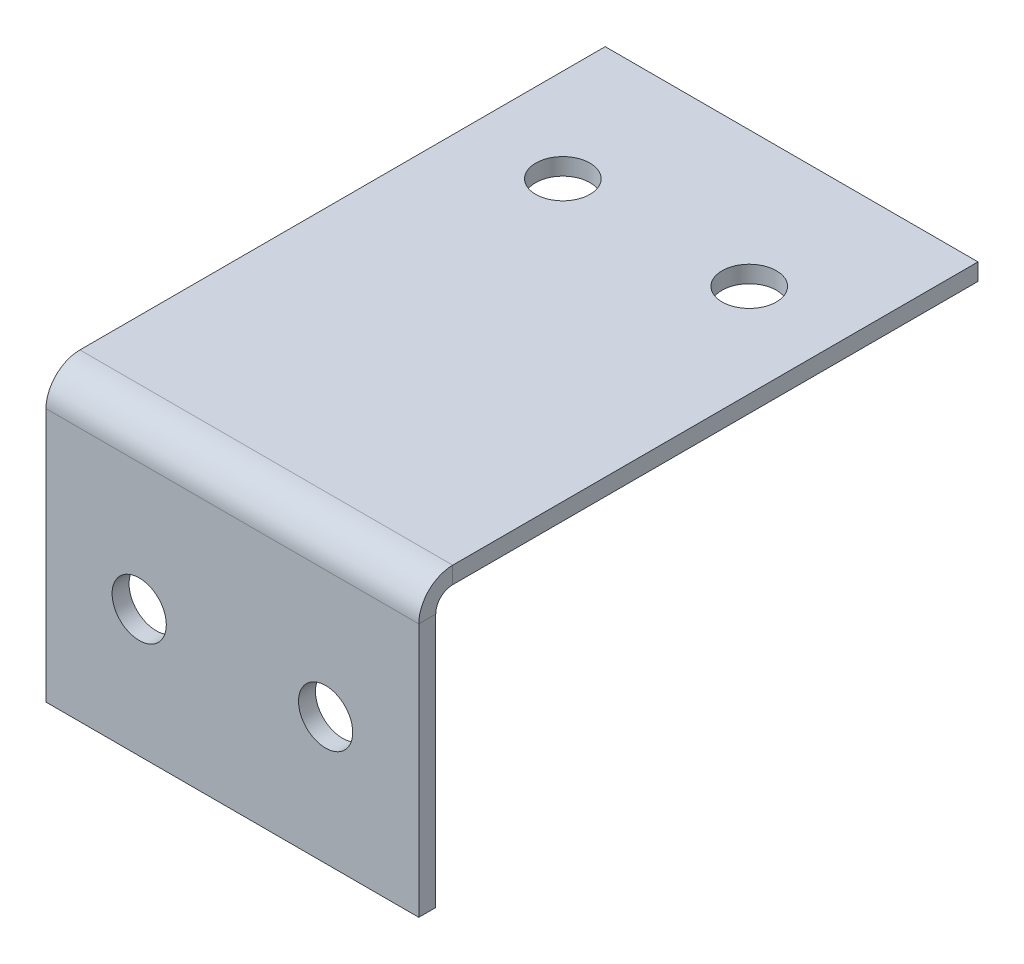
ISO-10303-21;
HEADER;
FILE_DESCRIPTION(('STEP AP214'),'2;1');
FILE_NAME('part.step','',(''),(''),'','','');
FILE_SCHEMA(('AUTOMOTIVE_DESIGN { 1 0 10303 214 1 1 1 1 }'));
ENDSEC;
DATA;
#1=APPLICATION_CONTEXT('core data for automotive mechanical design processes');
#2=APPLICATION_PROTOCOL_DEFINITION('international standard','automotive_design',2000,#1);
#3=PRODUCT_CONTEXT('',#1,'mechanical');
#4=PRODUCT('Part','Part','',(#3));
#5=PRODUCT_RELATED_PRODUCT_CATEGORY('part','',(#4));
#6=PRODUCT_DEFINITION_FORMATION('','',#4);
#7=PRODUCT_DEFINITION_CONTEXT('part definition',#1,'design');
#8=PRODUCT_DEFINITION('design','',#6,#7);
#9=PRODUCT_DEFINITION_SHAPE('','',#8);
#10=(LENGTH_UNIT() NAMED_UNIT(*) SI_UNIT(.MILLI.,.METRE.));
#11=(NAMED_UNIT(*) PLANE_ANGLE_UNIT() SI_UNIT($,.RADIAN.));
#12=(NAMED_UNIT(*) SI_UNIT($,.STERADIAN.) SOLID_ANGLE_UNIT());
#13=UNCERTAINTY_MEASURE_WITH_UNIT(LENGTH_MEASURE(1.E-05),#10,'distance_accuracy_value','');
#14=(GEOMETRIC_REPRESENTATION_CONTEXT(3) GLOBAL_UNCERTAINTY_ASSIGNED_CONTEXT((#13)) GLOBAL_UNIT_ASSIGNED_CONTEXT((#10,
#11,#12)) REPRESENTATION_CONTEXT('',''));
#15=CARTESIAN_POINT('',(0.,0.,0.));
#16=DIRECTION('',(0.,0.,1.));
#17=DIRECTION('',(1.,0.,0.));
#18=AXIS2_PLACEMENT_3D('',#15,#16,#17);
#19=CARTESIAN_POINT('',(-17.4625,25.4,-1.5875));
#20=DIRECTION('',(-1.,0.,0.));
#21=DIRECTION('',(0.,0.,1.));
#22=AXIS2_PLACEMENT_3D('',#19,#20,#21);
#23=PLANE('',#22);
#24=DIRECTION('',(0.,1.,0.));
#25=VECTOR('',#24,1.);
#26=CARTESIAN_POINT('',(-17.4625,25.4,-1.5875));
#27=LINE('',#26,#25);
#28=CARTESIAN_POINT('',(-17.4625,25.4,-1.5875));
#29=VERTEX_POINT('',#28);
#30=CARTESIAN_POINT('',(-17.4625,26.9875,-1.5875));
#31=VERTEX_POINT('',#30);
#32=EDGE_CURVE('E11',#29,#31,#27,.T.);
#33=ORIENTED_EDGE('',*,*,#32,.F.);
#34=CARTESIAN_POINT('',(-17.4625,23.8125,-1.5875));
#35=DIRECTION('',(1.,0.,0.));
#36=DIRECTION('',(0.,0.,-1.));
#37=AXIS2_PLACEMENT_3D('',#34,#35,#36);
#38=CIRCLE('',#37,1.5875);
#39=CARTESIAN_POINT('',(-17.4625,23.8125,0.));
#40=VERTEX_POINT('',#39);
#41=EDGE_CURVE('E135',#40,#29,#38,.F.);
#42=ORIENTED_EDGE('',*,*,#41,.F.);
#43=DIRECTION('',(0.,0.,-1.));
#44=VECTOR('',#43,1.);
#45=CARTESIAN_POINT('',(-17.4625,23.8125,1.5875));
#46=LINE('',#45,#44);
#47=CARTESIAN_POINT('',(-17.4625,23.8125,1.5875));
#48=VERTEX_POINT('',#47);
#49=EDGE_CURVE('E46',#48,#40,#46,.T.);
#50=ORIENTED_EDGE('',*,*,#49,.F.);
#51=CARTESIAN_POINT('',(-17.4625,23.8125,-1.5875));
#52=DIRECTION('',(1.,0.,0.));
#53=DIRECTION('',(0.,0.,-1.));
#54=AXIS2_PLACEMENT_3D('',#51,#52,#53);
#55=CIRCLE('',#54,3.175);
#56=EDGE_CURVE('E188',#48,#31,#55,.F.);
#57=ORIENTED_EDGE('',*,*,#56,.T.);
#58=EDGE_LOOP('',(#33,#42,#50,#57));
#59=FACE_BOUND('',#58,.T.);
#60=ADVANCED_FACE('F38',(#59),#23,.T.);
#61=CARTESIAN_POINT('',(-17.4625,23.8125,1.5875));
#62=DIRECTION('',(-1.,0.,0.));
#63=DIRECTION('',(0.,0.,1.));
#64=AXIS2_PLACEMENT_3D('',#61,#62,#63);
#65=PLANE('',#64);
#66=DIRECTION('',(0.,0.,-1.));
#67=VECTOR('',#66,1.);
#68=CARTESIAN_POINT('',(-17.4625,25.4,0.));
#69=LINE('',#68,#67);
#70=CARTESIAN_POINT('',(-17.4625,25.4,-50.8));
#71=VERTEX_POINT('',#70);
#72=EDGE_CURVE('E161',#29,#71,#69,.T.);
#73=ORIENTED_EDGE('',*,*,#72,.F.);
#74=ORIENTED_EDGE('',*,*,#32,.T.);
#75=DIRECTION('',(0.,0.,-1.));
#76=VECTOR('',#75,1.);
#77=CARTESIAN_POINT('',(-17.4625,26.9875,0.));
#78=LINE('',#77,#76);
#79=CARTESIAN_POINT('',(-17.4625,26.9875,-50.8));
#80=VERTEX_POINT('',#79);
#81=EDGE_CURVE('E204',#31,#80,#78,.T.);
#82=ORIENTED_EDGE('',*,*,#81,.T.);
#83=DIRECTION('',(0.,-1.,0.));
#84=VECTOR('',#83,1.);
#85=CARTESIAN_POINT('',(-17.4625,26.9875,-50.8));
#86=LINE('',#85,#84);
#87=EDGE_CURVE('E97',#80,#71,#86,.T.);
#88=ORIENTED_EDGE('',*,*,#87,.T.);
#89=EDGE_LOOP('',(#73,#74,#82,#88));
#90=FACE_BOUND('',#89,.T.);
#91=ADVANCED_FACE('F260',(#90),#65,.T.);
#92=CARTESIAN_POINT('',(17.4625,23.8125,0.));
#93=DIRECTION('',(1.,0.,0.));
#94=DIRECTION('',(0.,0.,-1.));
#95=AXIS2_PLACEMENT_3D('',#92,#93,#94);
#96=PLANE('',#95);
#97=DIRECTION('',(0.,0.,1.));
#98=VECTOR('',#97,1.);
#99=CARTESIAN_POINT('',(17.4625,23.8125,0.));
#100=LINE('',#99,#98);
#101=CARTESIAN_POINT('',(17.4625,23.8125,0.));
#102=VERTEX_POINT('',#101);
#103=CARTESIAN_POINT('',(17.4625,23.8125,1.5875));
#104=VERTEX_POINT('',#103);
#105=EDGE_CURVE('E81',#102,#104,#100,.T.);
#106=ORIENTED_EDGE('',*,*,#105,.F.);
#107=CARTESIAN_POINT('',(17.4625,23.8125,-1.5875));
#108=DIRECTION('',(1.,0.,0.));
#109=DIRECTION('',(0.,0.,-1.));
#110=AXIS2_PLACEMENT_3D('',#107,#108,#109);
#111=CIRCLE('',#110,1.5875);
#112=CARTESIAN_POINT('',(17.4625,25.4,-1.5875));
#113=VERTEX_POINT('',#112);
#114=EDGE_CURVE('E159',#102,#113,#111,.F.);
#115=ORIENTED_EDGE('',*,*,#114,.T.);
#116=DIRECTION('',(0.,-1.,0.));
#117=VECTOR('',#116,1.);
#118=CARTESIAN_POINT('',(17.4625,26.9875,-1.5875));
#119=LINE('',#118,#117);
#120=CARTESIAN_POINT('',(17.4625,26.9875,-1.5875));
#121=VERTEX_POINT('',#120);
#122=EDGE_CURVE('E88',#121,#113,#119,.T.);
#123=ORIENTED_EDGE('',*,*,#122,.F.);
#124=CARTESIAN_POINT('',(17.4625,23.8125,-1.5875));
#125=DIRECTION('',(1.,0.,0.));
#126=DIRECTION('',(0.,0.,-1.));
#127=AXIS2_PLACEMENT_3D('',#124,#125,#126);
#128=CIRCLE('',#127,3.175);
#129=EDGE_CURVE('E150',#104,#121,#128,.F.);
#130=ORIENTED_EDGE('',*,*,#129,.F.);
#131=EDGE_LOOP('',(#106,#115,#123,#130));
#132=FACE_BOUND('',#131,.T.);
#133=ADVANCED_FACE('F189',(#132),#96,.T.);
#134=CARTESIAN_POINT('',(17.4625,26.9875,-1.5875));
#135=DIRECTION('',(1.,0.,0.));
#136=DIRECTION('',(0.,0.,-1.));
#137=AXIS2_PLACEMENT_3D('',#134,#135,#136);
#138=PLANE('',#137);
#139=DIRECTION('',(0.,1.,0.));
#140=VECTOR('',#139,1.);
#141=CARTESIAN_POINT('',(17.4625,0.,0.));
#142=LINE('',#141,#140);
#143=CARTESIAN_POINT('',(17.4625,0.,0.));
#144=VERTEX_POINT('',#143);
#145=EDGE_CURVE('E118',#144,#102,#142,.T.);
#146=ORIENTED_EDGE('',*,*,#145,.T.);
#147=ORIENTED_EDGE('',*,*,#105,.T.);
#148=DIRECTION('',(0.,1.,0.));
#149=VECTOR('',#148,1.);
#150=CARTESIAN_POINT('',(17.4625,0.,1.5875));
#151=LINE('',#150,#149);
#152=CARTESIAN_POINT('',(17.4625,0.,1.5875));
#153=VERTEX_POINT('',#152);
#154=EDGE_CURVE('E153',#153,#104,#151,.T.);
#155=ORIENTED_EDGE('',*,*,#154,.F.);
#156=DIRECTION('',(0.,0.,1.));
#157=VECTOR('',#156,1.);
#158=CARTESIAN_POINT('',(17.4625,0.,0.));
#159=LINE('',#158,#157);
#160=EDGE_CURVE('E156',#144,#153,#159,.T.);
#161=ORIENTED_EDGE('',*,*,#160,.F.);
#162=EDGE_LOOP('',(#146,#147,#155,#161));
#163=FACE_BOUND('',#162,.T.);
#164=ADVANCED_FACE('F179',(#163),#138,.T.);
#165=CARTESIAN_POINT('',(-17.4625,25.4,0.));
#166=DIRECTION('',(0.,-1.,0.));
#167=DIRECTION('',(0.,0.,-1.));
#168=AXIS2_PLACEMENT_3D('',#165,#166,#167);
#169=PLANE('',#168);
#170=CARTESIAN_POINT('',(8.73125,25.4,-38.1));
#171=DIRECTION('',(0.,1.,0.));
#172=DIRECTION('',(0.,0.,1.));
#173=AXIS2_PLACEMENT_3D('',#170,#171,#172);
#174=CIRCLE('',#173,2.54);
#175=CARTESIAN_POINT('',(8.73125,25.4,-35.56));
#176=VERTEX_POINT('',#175);
#177=EDGE_CURVE('E225',#176,#176,#174,.T.);
#178=ORIENTED_EDGE('',*,*,#177,.T.);
#179=EDGE_LOOP('',(#178));
#180=FACE_BOUND('',#179,.T.);
#181=CARTESIAN_POINT('',(-8.73125,25.4,-38.1));
#182=DIRECTION('',(0.,1.,0.));
#183=DIRECTION('',(0.,0.,1.));
#184=AXIS2_PLACEMENT_3D('',#181,#182,#183);
#185=CIRCLE('',#184,2.54);
#186=CARTESIAN_POINT('',(-8.73125,25.4,-35.56));
#187=VERTEX_POINT('',#186);
#188=EDGE_CURVE('E219',#187,#187,#185,.T.);
#189=ORIENTED_EDGE('',*,*,#188,.T.);
#190=EDGE_LOOP('',(#189));
#191=FACE_BOUND('',#190,.T.);
#192=DIRECTION('',(0.,0.,-1.));
#193=VECTOR('',#192,1.);
#194=CARTESIAN_POINT('',(17.4625,25.4,0.));
#195=LINE('',#194,#193);
#196=CARTESIAN_POINT('',(17.4625,25.4,-50.8));
#197=VERTEX_POINT('',#196);
#198=EDGE_CURVE('E142',#113,#197,#195,.T.);
#199=ORIENTED_EDGE('',*,*,#198,.F.);
#200=DIRECTION('',(1.,0.,0.));
#201=VECTOR('',#200,1.);
#202=CARTESIAN_POINT('',(-17.4625,25.4,-1.5875));
#203=LINE('',#202,#201);
#204=EDGE_CURVE('E162',#29,#113,#203,.T.);
#205=ORIENTED_EDGE('',*,*,#204,.F.);
#206=ORIENTED_EDGE('',*,*,#72,.T.);
#207=DIRECTION('',(1.,0.,0.));
#208=VECTOR('',#207,1.);
#209=CARTESIAN_POINT('',(-17.4625,25.4,-50.8));
#210=LINE('',#209,#208);
#211=EDGE_CURVE('E138',#71,#197,#210,.T.);
#212=ORIENTED_EDGE('',*,*,#211,.T.);
#213=EDGE_LOOP('',(#199,#205,#206,#212));
#214=FACE_BOUND('',#213,.T.);
#215=ADVANCED_FACE('F195',(#180,#191,#214),#169,.T.);
#216=CARTESIAN_POINT('',(-17.4625,23.8125,-1.5875));
#217=DIRECTION('',(1.,0.,0.));
#218=DIRECTION('',(0.,0.,-1.));
#219=AXIS2_PLACEMENT_3D('',#216,#217,#218);
#220=CYLINDRICAL_SURFACE('',#219,1.5875);
#221=ORIENTED_EDGE('',*,*,#114,.F.);
#222=DIRECTION('',(1.,0.,0.));
#223=VECTOR('',#222,1.);
#224=CARTESIAN_POINT('',(-17.4625,23.8125,0.));
#225=LINE('',#224,#223);
#226=EDGE_CURVE('E121',#40,#102,#225,.T.);
#227=ORIENTED_EDGE('',*,*,#226,.F.);
#228=ORIENTED_EDGE('',*,*,#41,.T.);
#229=ORIENTED_EDGE('',*,*,#204,.T.);
#230=EDGE_LOOP('',(#221,#227,#228,#229));
#231=FACE_BOUND('',#230,.T.);
#232=ADVANCED_FACE('F191',(#231),#220,.F.);
#233=CARTESIAN_POINT('',(-17.4625,0.,0.));
#234=DIRECTION('',(0.,0.,-1.));
#235=DIRECTION('',(-1.,0.,0.));
#236=AXIS2_PLACEMENT_3D('',#233,#234,#235);
#237=PLANE('',#236);
#238=CARTESIAN_POINT('',(8.73125,11.90625,0.));
#239=DIRECTION('',(0.,0.,1.));
#240=DIRECTION('',(1.,0.,0.));
#241=AXIS2_PLACEMENT_3D('',#238,#239,#240);
#242=CIRCLE('',#241,2.54);
#243=CARTESIAN_POINT('',(11.27125,11.90625,0.));
#244=VERTEX_POINT('',#243);
#245=EDGE_CURVE('E213',#244,#244,#242,.T.);
#246=ORIENTED_EDGE('',*,*,#245,.T.);
#247=EDGE_LOOP('',(#246));
#248=FACE_BOUND('',#247,.T.);
#249=CARTESIAN_POINT('',(-8.73125,11.90625,0.));
#250=DIRECTION('',(0.,0.,1.));
#251=DIRECTION('',(1.,0.,0.));
#252=AXIS2_PLACEMENT_3D('',#249,#250,#251);
#253=CIRCLE('',#252,2.54);
#254=CARTESIAN_POINT('',(-6.19125,11.90625,0.));
#255=VERTEX_POINT('',#254);
#256=EDGE_CURVE('E145',#255,#255,#253,.T.);
#257=ORIENTED_EDGE('',*,*,#256,.T.);
#258=EDGE_LOOP('',(#257));
#259=FACE_BOUND('',#258,.T.);
#260=ORIENTED_EDGE('',*,*,#145,.F.);
#261=DIRECTION('',(1.,0.,0.));
#262=VECTOR('',#261,1.);
#263=CARTESIAN_POINT('',(-17.4625,0.,0.));
#264=LINE('',#263,#262);
#265=CARTESIAN_POINT('',(-17.4625,0.,0.));
#266=VERTEX_POINT('',#265);
#267=EDGE_CURVE('E112',#266,#144,#264,.T.);
#268=ORIENTED_EDGE('',*,*,#267,.F.);
#269=DIRECTION('',(0.,1.,0.));
#270=VECTOR('',#269,1.);
#271=CARTESIAN_POINT('',(-17.4625,0.,0.));
#272=LINE('',#271,#270);
#273=EDGE_CURVE('E116',#266,#40,#272,.T.);
#274=ORIENTED_EDGE('',*,*,#273,.T.);
#275=ORIENTED_EDGE('',*,*,#226,.T.);
#276=EDGE_LOOP('',(#260,#268,#274,#275));
#277=FACE_BOUND('',#276,.T.);
#278=ADVANCED_FACE('F114',(#248,#259,#277),#237,.T.);
#279=CARTESIAN_POINT('',(-17.4625,0.,0.));
#280=DIRECTION('',(0.,1.,0.));
#281=DIRECTION('',(0.,0.,1.));
#282=AXIS2_PLACEMENT_3D('',#279,#280,#281);
#283=PLANE('',#282);
#284=ORIENTED_EDGE('',*,*,#160,.T.);
#285=DIRECTION('',(1.,0.,0.));
#286=VECTOR('',#285,1.);
#287=CARTESIAN_POINT('',(-17.4625,0.,1.5875));
#288=LINE('',#287,#286);
#289=CARTESIAN_POINT('',(-17.4625,0.,1.5875));
#290=VERTEX_POINT('',#289);
#291=EDGE_CURVE('E122',#290,#153,#288,.T.);
#292=ORIENTED_EDGE('',*,*,#291,.F.);
#293=DIRECTION('',(0.,0.,1.));
#294=VECTOR('',#293,1.);
#295=CARTESIAN_POINT('',(-17.4625,0.,0.));
#296=LINE('',#295,#294);
#297=EDGE_CURVE('E125',#266,#290,#296,.T.);
#298=ORIENTED_EDGE('',*,*,#297,.F.);
#299=ORIENTED_EDGE('',*,*,#267,.T.);
#300=EDGE_LOOP('',(#284,#292,#298,#299));
#301=FACE_BOUND('',#300,.T.);
#302=ADVANCED_FACE('F126',(#301),#283,.F.);
#303=CARTESIAN_POINT('',(-17.4625,0.,1.5875));
#304=DIRECTION('',(0.,0.,-1.));
#305=DIRECTION('',(-1.,0.,0.));
#306=AXIS2_PLACEMENT_3D('',#303,#304,#305);
#307=PLANE('',#306);
#308=CARTESIAN_POINT('',(8.73125,11.90625,1.5875));
#309=DIRECTION('',(0.,0.,1.));
#310=DIRECTION('',(1.,0.,0.));
#311=AXIS2_PLACEMENT_3D('',#308,#309,#310);
#312=CIRCLE('',#311,2.54);
#313=CARTESIAN_POINT('',(11.27125,11.90625,1.5875));
#314=VERTEX_POINT('',#313);
#315=EDGE_CURVE('E216',#314,#314,#312,.T.);
#316=ORIENTED_EDGE('',*,*,#315,.F.);
#317=EDGE_LOOP('',(#316));
#318=FACE_BOUND('',#317,.T.);
#319=CARTESIAN_POINT('',(-8.73125,11.90625,1.5875));
#320=DIRECTION('',(0.,0.,1.));
#321=DIRECTION('',(1.,0.,0.));
#322=AXIS2_PLACEMENT_3D('',#319,#320,#321);
#323=CIRCLE('',#322,2.54);
#324=CARTESIAN_POINT('',(-6.19125,11.90625,1.5875));
#325=VERTEX_POINT('',#324);
#326=EDGE_CURVE('E210',#325,#325,#323,.T.);
#327=ORIENTED_EDGE('',*,*,#326,.F.);
#328=EDGE_LOOP('',(#327));
#329=FACE_BOUND('',#328,.T.);
#330=ORIENTED_EDGE('',*,*,#154,.T.);
#331=DIRECTION('',(1.,0.,0.));
#332=VECTOR('',#331,1.);
#333=CARTESIAN_POINT('',(-17.4625,23.8125,1.5875));
#334=LINE('',#333,#332);
#335=EDGE_CURVE('E166',#48,#104,#334,.T.);
#336=ORIENTED_EDGE('',*,*,#335,.F.);
#337=DIRECTION('',(0.,1.,0.));
#338=VECTOR('',#337,1.);
#339=CARTESIAN_POINT('',(-17.4625,0.,1.5875));
#340=LINE('',#339,#338);
#341=EDGE_CURVE('E131',#290,#48,#340,.T.);
#342=ORIENTED_EDGE('',*,*,#341,.F.);
#343=ORIENTED_EDGE('',*,*,#291,.T.);
#344=EDGE_LOOP('',(#330,#336,#342,#343));
#345=FACE_BOUND('',#344,.T.);
#346=ADVANCED_FACE('F183',(#318,#329,#345),#307,.F.);
#347=CARTESIAN_POINT('',(-17.4625,23.8125,-1.5875));
#348=DIRECTION('',(1.,0.,0.));
#349=DIRECTION('',(0.,0.,-1.));
#350=AXIS2_PLACEMENT_3D('',#347,#348,#349);
#351=CYLINDRICAL_SURFACE('',#350,3.175);
#352=ORIENTED_EDGE('',*,*,#129,.T.);
#353=DIRECTION('',(1.,0.,0.));
#354=VECTOR('',#353,1.);
#355=CARTESIAN_POINT('',(-17.4625,26.9875,-1.5875));
#356=LINE('',#355,#354);
#357=EDGE_CURVE('E169',#31,#121,#356,.T.);
#358=ORIENTED_EDGE('',*,*,#357,.F.);
#359=ORIENTED_EDGE('',*,*,#56,.F.);
#360=ORIENTED_EDGE('',*,*,#335,.T.);
#361=EDGE_LOOP('',(#352,#358,#359,#360));
#362=FACE_BOUND('',#361,.T.);
#363=ADVANCED_FACE('F186',(#362),#351,.T.);
#364=CARTESIAN_POINT('',(-17.4625,26.9875,0.));
#365=DIRECTION('',(0.,-1.,0.));
#366=DIRECTION('',(0.,0.,-1.));
#367=AXIS2_PLACEMENT_3D('',#364,#365,#366);
#368=PLANE('',#367);
#369=CARTESIAN_POINT('',(8.73125,26.9875,-38.1));
#370=DIRECTION('',(0.,1.,0.));
#371=DIRECTION('',(0.,0.,1.));
#372=AXIS2_PLACEMENT_3D('',#369,#370,#371);
#373=CIRCLE('',#372,2.54);
#374=CARTESIAN_POINT('',(8.73125,26.9875,-35.56));
#375=VERTEX_POINT('',#374);
#376=EDGE_CURVE('E228',#375,#375,#373,.T.);
#377=ORIENTED_EDGE('',*,*,#376,.F.);
#378=EDGE_LOOP('',(#377));
#379=FACE_BOUND('',#378,.T.);
#380=CARTESIAN_POINT('',(-8.73125,26.9875,-38.1));
#381=DIRECTION('',(0.,1.,0.));
#382=DIRECTION('',(0.,0.,1.));
#383=AXIS2_PLACEMENT_3D('',#380,#381,#382);
#384=CIRCLE('',#383,2.54);
#385=CARTESIAN_POINT('',(-8.73125,26.9875,-35.56));
#386=VERTEX_POINT('',#385);
#387=EDGE_CURVE('E222',#386,#386,#384,.T.);
#388=ORIENTED_EDGE('',*,*,#387,.F.);
#389=EDGE_LOOP('',(#388));
#390=FACE_BOUND('',#389,.T.);
#391=DIRECTION('',(0.,0.,-1.));
#392=VECTOR('',#391,1.);
#393=CARTESIAN_POINT('',(17.4625,26.9875,0.));
#394=LINE('',#393,#392);
#395=CARTESIAN_POINT('',(17.4625,26.9875,-50.8));
#396=VERTEX_POINT('',#395);
#397=EDGE_CURVE('E148',#121,#396,#394,.T.);
#398=ORIENTED_EDGE('',*,*,#397,.T.);
#399=DIRECTION('',(1.,0.,0.));
#400=VECTOR('',#399,1.);
#401=CARTESIAN_POINT('',(-17.4625,26.9875,-50.8));
#402=LINE('',#401,#400);
#403=EDGE_CURVE('E172',#80,#396,#402,.T.);
#404=ORIENTED_EDGE('',*,*,#403,.F.);
#405=ORIENTED_EDGE('',*,*,#81,.F.);
#406=ORIENTED_EDGE('',*,*,#357,.T.);
#407=EDGE_LOOP('',(#398,#404,#405,#406));
#408=FACE_BOUND('',#407,.T.);
#409=ADVANCED_FACE('F203',(#379,#390,#408),#368,.F.);
#410=CARTESIAN_POINT('',(-17.4625,26.9875,-50.8));
#411=DIRECTION('',(0.,0.,1.));
#412=DIRECTION('',(1.,0.,0.));
#413=AXIS2_PLACEMENT_3D('',#410,#411,#412);
#414=PLANE('',#413);
#415=DIRECTION('',(0.,-1.,0.));
#416=VECTOR('',#415,1.);
#417=CARTESIAN_POINT('',(17.4625,26.9875,-50.8));
#418=LINE('',#417,#416);
#419=EDGE_CURVE('E144',#396,#197,#418,.T.);
#420=ORIENTED_EDGE('',*,*,#419,.T.);
#421=ORIENTED_EDGE('',*,*,#211,.F.);
#422=ORIENTED_EDGE('',*,*,#87,.F.);
#423=ORIENTED_EDGE('',*,*,#403,.T.);
#424=EDGE_LOOP('',(#420,#421,#422,#423));
#425=FACE_BOUND('',#424,.T.);
#426=ADVANCED_FACE('F199',(#425),#414,.F.);
#427=CARTESIAN_POINT('',(-17.4625,23.8125,-1.5875));
#428=DIRECTION('',(1.,0.,0.));
#429=DIRECTION('',(0.,0.,-1.));
#430=AXIS2_PLACEMENT_3D('',#427,#428,#429);
#431=PLANE('',#430);
#432=ORIENTED_EDGE('',*,*,#341,.T.);
#433=ORIENTED_EDGE('',*,*,#49,.T.);
#434=ORIENTED_EDGE('',*,*,#273,.F.);
#435=ORIENTED_EDGE('',*,*,#297,.T.);
#436=EDGE_LOOP('',(#432,#433,#434,#435));
#437=FACE_BOUND('',#436,.T.);
#438=ADVANCED_FACE('F133',(#437),#431,.F.);
#439=CARTESIAN_POINT('',(17.4625,23.8125,-1.5875));
#440=DIRECTION('',(1.,0.,0.));
#441=DIRECTION('',(0.,0.,-1.));
#442=AXIS2_PLACEMENT_3D('',#439,#440,#441);
#443=PLANE('',#442);
#444=ORIENTED_EDGE('',*,*,#198,.T.);
#445=ORIENTED_EDGE('',*,*,#419,.F.);
#446=ORIENTED_EDGE('',*,*,#397,.F.);
#447=ORIENTED_EDGE('',*,*,#122,.T.);
#448=EDGE_LOOP('',(#444,#445,#446,#447));
#449=FACE_BOUND('',#448,.T.);
#450=ADVANCED_FACE('F197',(#449),#443,.T.);
#451=CARTESIAN_POINT('',(-8.73125,11.90625,0.));
#452=DIRECTION('',(0.,0.,1.));
#453=DIRECTION('',(1.,0.,0.));
#454=AXIS2_PLACEMENT_3D('',#451,#452,#453);
#455=CYLINDRICAL_SURFACE('',#454,2.54);
#456=ORIENTED_EDGE('',*,*,#256,.F.);
#457=EDGE_LOOP('',(#456));
#458=FACE_BOUND('',#457,.T.);
#459=ORIENTED_EDGE('',*,*,#326,.T.);
#460=EDGE_LOOP('',(#459));
#461=FACE_BOUND('',#460,.T.);
#462=ADVANCED_FACE('F255',(#458,#461),#455,.F.);
#463=CARTESIAN_POINT('',(8.73125,11.90625,0.));
#464=DIRECTION('',(0.,0.,1.));
#465=DIRECTION('',(1.,0.,0.));
#466=AXIS2_PLACEMENT_3D('',#463,#464,#465);
#467=CYLINDRICAL_SURFACE('',#466,2.54);
#468=ORIENTED_EDGE('',*,*,#245,.F.);
#469=EDGE_LOOP('',(#468));
#470=FACE_BOUND('',#469,.T.);
#471=ORIENTED_EDGE('',*,*,#315,.T.);
#472=EDGE_LOOP('',(#471));
#473=FACE_BOUND('',#472,.T.);
#474=ADVANCED_FACE('F249',(#470,#473),#467,.F.);
#475=CARTESIAN_POINT('',(-8.73125,25.4,-38.1));
#476=DIRECTION('',(0.,1.,0.));
#477=DIRECTION('',(0.,0.,1.));
#478=AXIS2_PLACEMENT_3D('',#475,#476,#477);
#479=CYLINDRICAL_SURFACE('',#478,2.54);
#480=ORIENTED_EDGE('',*,*,#188,.F.);
#481=EDGE_LOOP('',(#480));
#482=FACE_BOUND('',#481,.T.);
#483=ORIENTED_EDGE('',*,*,#387,.T.);
#484=EDGE_LOOP('',(#483));
#485=FACE_BOUND('',#484,.T.);
#486=ADVANCED_FACE('F239',(#482,#485),#479,.F.);
#487=CARTESIAN_POINT('',(8.73125,25.4,-38.1));
#488=DIRECTION('',(0.,1.,0.));
#489=DIRECTION('',(0.,0.,1.));
#490=AXIS2_PLACEMENT_3D('',#487,#488,#489);
#491=CYLINDRICAL_SURFACE('',#490,2.54);
#492=ORIENTED_EDGE('',*,*,#177,.F.);
#493=EDGE_LOOP('',(#492));
#494=FACE_BOUND('',#493,.T.);
#495=ORIENTED_EDGE('',*,*,#376,.T.);
#496=EDGE_LOOP('',(#495));
#497=FACE_BOUND('',#496,.T.);
#498=ADVANCED_FACE('F236',(#494,#497),#491,.F.);
#499=CLOSED_SHELL('',(#60,#91,#133,#164,#215,#232,#278,#302,#346,#363,#409,#426,#438,#450,#462,
#474,#486,#498));
#500=MANIFOLD_SOLID_BREP('B2',#499);
#501=ADVANCED_BREP_SHAPE_REPRESENTATION('',(#18,#500),#14);
#502=SHAPE_DEFINITION_REPRESENTATION(#9,#501);
ENDSEC;
END-ISO-10303-21;
